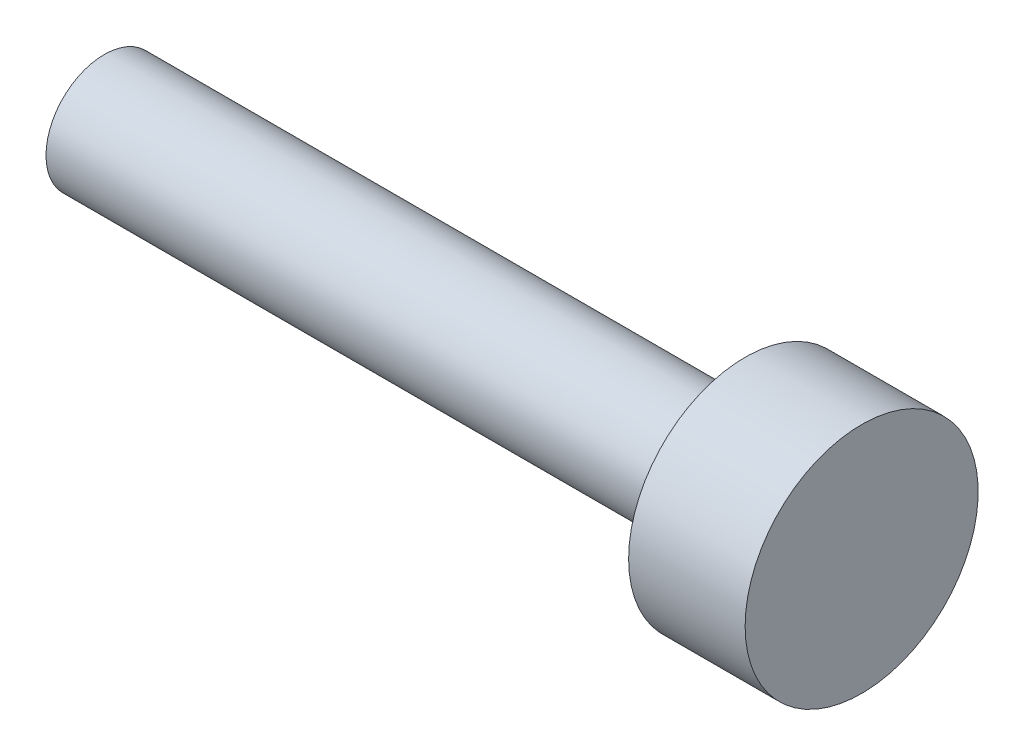
ISO-10303-21;
HEADER;
FILE_DESCRIPTION(('STEP AP214'),'2;1');
FILE_NAME('part.step','',(''),(''),'','','');
FILE_SCHEMA(('AUTOMOTIVE_DESIGN { 1 0 10303 214 1 1 1 1 }'));
ENDSEC;
DATA;
#1=APPLICATION_CONTEXT('core data for automotive mechanical design processes');
#2=APPLICATION_PROTOCOL_DEFINITION('international standard','automotive_design',2000,#1);
#3=PRODUCT_CONTEXT('',#1,'mechanical');
#4=PRODUCT('Part','Part','',(#3));
#5=PRODUCT_RELATED_PRODUCT_CATEGORY('part','',(#4));
#6=PRODUCT_DEFINITION_FORMATION('','',#4);
#7=PRODUCT_DEFINITION_CONTEXT('part definition',#1,'design');
#8=PRODUCT_DEFINITION('design','',#6,#7);
#9=PRODUCT_DEFINITION_SHAPE('','',#8);
#10=(LENGTH_UNIT() NAMED_UNIT(*) SI_UNIT(.MILLI.,.METRE.));
#11=(NAMED_UNIT(*) PLANE_ANGLE_UNIT() SI_UNIT($,.RADIAN.));
#12=(NAMED_UNIT(*) SI_UNIT($,.STERADIAN.) SOLID_ANGLE_UNIT());
#13=UNCERTAINTY_MEASURE_WITH_UNIT(LENGTH_MEASURE(1.E-05),#10,'distance_accuracy_value','');
#14=(GEOMETRIC_REPRESENTATION_CONTEXT(3) GLOBAL_UNCERTAINTY_ASSIGNED_CONTEXT((#13)) GLOBAL_UNIT_ASSIGNED_CONTEXT((#10,
#11,#12)) REPRESENTATION_CONTEXT('',''));
#15=CARTESIAN_POINT('',(0.,0.,0.));
#16=DIRECTION('',(0.,0.,1.));
#17=DIRECTION('',(1.,0.,0.));
#18=AXIS2_PLACEMENT_3D('',#15,#16,#17);
#19=CARTESIAN_POINT('',(-116.835752997229,27.1754045737225,0.));
#20=DIRECTION('',(1.,0.,0.));
#21=DIRECTION('',(0.,0.,-1.));
#22=AXIS2_PLACEMENT_3D('',#19,#20,#21);
#23=PLANE('',#22);
#24=CARTESIAN_POINT('',(-116.835752997229,26.1754045737225,0.));
#25=DIRECTION('',(-1.,0.,0.));
#26=DIRECTION('',(0.,0.,1.));
#27=AXIS2_PLACEMENT_3D('',#24,#25,#26);
#28=CIRCLE('',#27,1.);
#29=CARTESIAN_POINT('',(-116.835752997229,26.1754045737225,1.));
#30=VERTEX_POINT('',#29);
#31=EDGE_CURVE('E10',#30,#30,#28,.T.);
#32=ORIENTED_EDGE('',*,*,#31,.T.);
#33=EDGE_LOOP('',(#32));
#34=FACE_BOUND('',#33,.T.);
#35=ADVANCED_FACE('F31',(#34),#23,.F.);
#36=CARTESIAN_POINT('',(-116.835752997229,26.1754045737225,0.));
#37=DIRECTION('',(-1.,0.,0.));
#38=DIRECTION('',(0.,0.,1.));
#39=AXIS2_PLACEMENT_3D('',#36,#37,#38);
#40=CYLINDRICAL_SURFACE('',#39,1.);
#41=ORIENTED_EDGE('',*,*,#31,.F.);
#42=EDGE_LOOP('',(#41));
#43=FACE_BOUND('',#42,.T.);
#44=CARTESIAN_POINT('',(-105.835752997229,26.1754045737225,0.));
#45=DIRECTION('',(-1.,0.,0.));
#46=DIRECTION('',(0.,0.,1.));
#47=AXIS2_PLACEMENT_3D('',#44,#45,#46);
#48=CIRCLE('',#47,1.);
#49=CARTESIAN_POINT('',(-105.835752997229,26.1754045737225,1.));
#50=VERTEX_POINT('',#49);
#51=EDGE_CURVE('E37',#50,#50,#48,.T.);
#52=ORIENTED_EDGE('',*,*,#51,.T.);
#53=EDGE_LOOP('',(#52));
#54=FACE_BOUND('',#53,.T.);
#55=ADVANCED_FACE('F63',(#43,#54),#40,.T.);
#56=CARTESIAN_POINT('',(-105.835752997229,27.1754045737225,0.));
#57=DIRECTION('',(1.,0.,0.));
#58=DIRECTION('',(0.,0.,-1.));
#59=AXIS2_PLACEMENT_3D('',#56,#57,#58);
#60=PLANE('',#59);
#61=ORIENTED_EDGE('',*,*,#51,.F.);
#62=EDGE_LOOP('',(#61));
#63=FACE_BOUND('',#62,.T.);
#64=CARTESIAN_POINT('',(-105.835752997229,26.1754045737225,0.));
#65=DIRECTION('',(-1.,0.,0.));
#66=DIRECTION('',(0.,0.,1.));
#67=AXIS2_PLACEMENT_3D('',#64,#65,#66);
#68=CIRCLE('',#67,2.);
#69=CARTESIAN_POINT('',(-105.835752997229,26.1754045737225,2.));
#70=VERTEX_POINT('',#69);
#71=EDGE_CURVE('E41',#70,#70,#68,.T.);
#72=ORIENTED_EDGE('',*,*,#71,.T.);
#73=EDGE_LOOP('',(#72));
#74=FACE_BOUND('',#73,.T.);
#75=ADVANCED_FACE('F59',(#63,#74),#60,.F.);
#76=CARTESIAN_POINT('',(-116.835752997229,26.1754045737225,0.));
#77=DIRECTION('',(-1.,0.,0.));
#78=DIRECTION('',(0.,0.,1.));
#79=AXIS2_PLACEMENT_3D('',#76,#77,#78);
#80=CYLINDRICAL_SURFACE('',#79,2.);
#81=ORIENTED_EDGE('',*,*,#71,.F.);
#82=EDGE_LOOP('',(#81));
#83=FACE_BOUND('',#82,.T.);
#84=CARTESIAN_POINT('',(-103.835752997229,26.1754045737225,0.));
#85=DIRECTION('',(-1.,0.,0.));
#86=DIRECTION('',(0.,0.,1.));
#87=AXIS2_PLACEMENT_3D('',#84,#85,#86);
#88=CIRCLE('',#87,2.);
#89=CARTESIAN_POINT('',(-103.835752997229,26.1754045737225,2.));
#90=VERTEX_POINT('',#89);
#91=EDGE_CURVE('E45',#90,#90,#88,.T.);
#92=ORIENTED_EDGE('',*,*,#91,.T.);
#93=EDGE_LOOP('',(#92));
#94=FACE_BOUND('',#93,.T.);
#95=ADVANCED_FACE('F51',(#83,#94),#80,.T.);
#96=CARTESIAN_POINT('',(-103.835752997229,28.1754045737225,0.));
#97=DIRECTION('',(-1.,0.,0.));
#98=DIRECTION('',(0.,0.,1.));
#99=AXIS2_PLACEMENT_3D('',#96,#97,#98);
#100=PLANE('',#99);
#101=ORIENTED_EDGE('',*,*,#91,.F.);
#102=EDGE_LOOP('',(#101));
#103=FACE_BOUND('',#102,.T.);
#104=ADVANCED_FACE('F53',(#103),#100,.F.);
#105=CLOSED_SHELL('',(#35,#55,#75,#95,#104));
#106=MANIFOLD_SOLID_BREP('B2',#105);
#107=ADVANCED_BREP_SHAPE_REPRESENTATION('',(#18,#106),#14);
#108=SHAPE_DEFINITION_REPRESENTATION(#9,#107);
ENDSEC;
END-ISO-10303-21;
